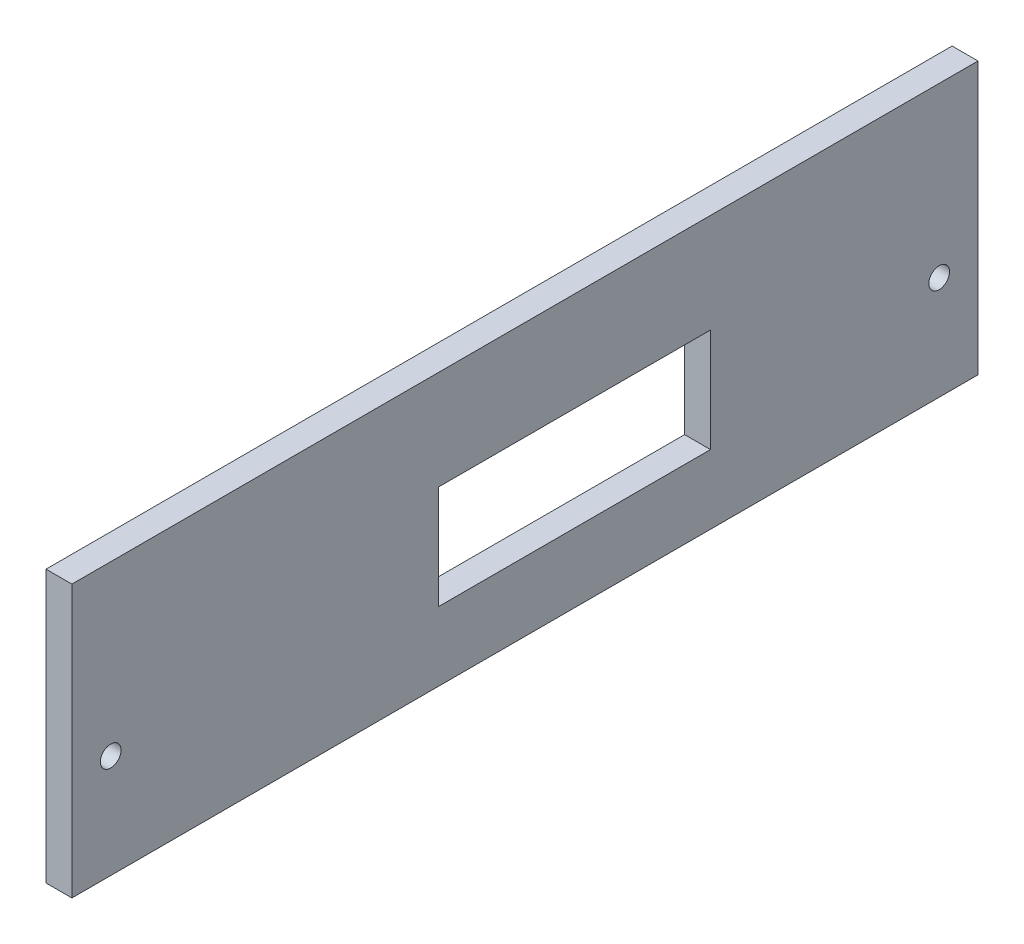
ISO-10303-21;
HEADER;
FILE_DESCRIPTION(('STEP AP214'),'2;1');
FILE_NAME('part.step','',(''),(''),'','','');
FILE_SCHEMA(('AUTOMOTIVE_DESIGN { 1 0 10303 214 1 1 1 1 }'));
ENDSEC;
DATA;
#1=APPLICATION_CONTEXT('core data for automotive mechanical design processes');
#2=APPLICATION_PROTOCOL_DEFINITION('international standard','automotive_design',2000,#1);
#3=PRODUCT_CONTEXT('',#1,'mechanical');
#4=PRODUCT('Part','Part','',(#3));
#5=PRODUCT_RELATED_PRODUCT_CATEGORY('part','',(#4));
#6=PRODUCT_DEFINITION_FORMATION('','',#4);
#7=PRODUCT_DEFINITION_CONTEXT('part definition',#1,'design');
#8=PRODUCT_DEFINITION('design','',#6,#7);
#9=PRODUCT_DEFINITION_SHAPE('','',#8);
#10=(LENGTH_UNIT() NAMED_UNIT(*) SI_UNIT(.MILLI.,.METRE.));
#11=(NAMED_UNIT(*) PLANE_ANGLE_UNIT() SI_UNIT($,.RADIAN.));
#12=(NAMED_UNIT(*) SI_UNIT($,.STERADIAN.) SOLID_ANGLE_UNIT());
#13=UNCERTAINTY_MEASURE_WITH_UNIT(LENGTH_MEASURE(1.E-05),#10,'distance_accuracy_value','');
#14=(GEOMETRIC_REPRESENTATION_CONTEXT(3) GLOBAL_UNCERTAINTY_ASSIGNED_CONTEXT((#13)) GLOBAL_UNIT_ASSIGNED_CONTEXT((#10,
#11,#12)) REPRESENTATION_CONTEXT('',''));
#15=CARTESIAN_POINT('',(0.,0.,0.));
#16=DIRECTION('',(0.,0.,1.));
#17=DIRECTION('',(1.,0.,0.));
#18=AXIS2_PLACEMENT_3D('',#15,#16,#17);
#19=CARTESIAN_POINT('',(-1.5,0.,0.));
#20=DIRECTION('',(1.,0.,0.));
#21=DIRECTION('',(0.,0.,-1.));
#22=AXIS2_PLACEMENT_3D('',#19,#20,#21);
#23=PLANE('',#22);
#24=CARTESIAN_POINT('',(-1.5,4.75,-49.5));
#25=DIRECTION('',(-1.,0.,0.));
#26=DIRECTION('',(0.,0.,1.));
#27=AXIS2_PLACEMENT_3D('',#24,#25,#26);
#28=CIRCLE('',#27,0.6);
#29=CARTESIAN_POINT('',(-1.5,4.75,-48.9));
#30=VERTEX_POINT('',#29);
#31=EDGE_CURVE('E127',#30,#30,#28,.T.);
#32=ORIENTED_EDGE('',*,*,#31,.F.);
#33=EDGE_LOOP('',(#32));
#34=FACE_BOUND('',#33,.T.);
#35=DIRECTION('',(0.,-1.,0.));
#36=VECTOR('',#35,1.);
#37=CARTESIAN_POINT('',(-1.5,14.5,-51.75));
#38=LINE('',#37,#36);
#39=CARTESIAN_POINT('',(-1.5,14.5,-51.75));
#40=VERTEX_POINT('',#39);
#41=CARTESIAN_POINT('',(-1.5,-1.25,-51.75));
#42=VERTEX_POINT('',#41);
#43=EDGE_CURVE('E137',#40,#42,#38,.T.);
#44=ORIENTED_EDGE('',*,*,#43,.T.);
#45=DIRECTION('',(0.,0.,1.));
#46=VECTOR('',#45,1.);
#47=CARTESIAN_POINT('',(-1.5,-1.25,0.75));
#48=LINE('',#47,#46);
#49=CARTESIAN_POINT('',(-1.5,-1.25,0.75));
#50=VERTEX_POINT('',#49);
#51=EDGE_CURVE('E140',#42,#50,#48,.T.);
#52=ORIENTED_EDGE('',*,*,#51,.T.);
#53=DIRECTION('',(0.,1.,0.));
#54=VECTOR('',#53,1.);
#55=CARTESIAN_POINT('',(-1.5,-1.25,0.75));
#56=LINE('',#55,#54);
#57=CARTESIAN_POINT('',(-1.5,14.5,0.75));
#58=VERTEX_POINT('',#57);
#59=EDGE_CURVE('E143',#50,#58,#56,.T.);
#60=ORIENTED_EDGE('',*,*,#59,.T.);
#61=DIRECTION('',(0.,0.,-1.));
#62=VECTOR('',#61,1.);
#63=CARTESIAN_POINT('',(-1.5,14.5,-51.75));
#64=LINE('',#63,#62);
#65=EDGE_CURVE('E145',#58,#40,#64,.T.);
#66=ORIENTED_EDGE('',*,*,#65,.T.);
#67=EDGE_LOOP('',(#44,#52,#60,#66));
#68=FACE_BOUND('',#67,.T.);
#69=DIRECTION('',(0.,0.,-1.));
#70=VECTOR('',#69,1.);
#71=CARTESIAN_POINT('',(-1.5,8.75,-36.25));
#72=LINE('',#71,#70);
#73=CARTESIAN_POINT('',(-1.5,8.75,-20.5));
#74=VERTEX_POINT('',#73);
#75=CARTESIAN_POINT('',(-1.5,8.75,-36.25));
#76=VERTEX_POINT('',#75);
#77=EDGE_CURVE('E98',#74,#76,#72,.T.);
#78=ORIENTED_EDGE('',*,*,#77,.F.);
#79=DIRECTION('',(0.,1.,0.));
#80=VECTOR('',#79,1.);
#81=CARTESIAN_POINT('',(-1.5,8.75,-20.5));
#82=LINE('',#81,#80);
#83=CARTESIAN_POINT('',(-1.5,2.75,-20.5));
#84=VERTEX_POINT('',#83);
#85=EDGE_CURVE('E121',#84,#74,#82,.T.);
#86=ORIENTED_EDGE('',*,*,#85,.F.);
#87=DIRECTION('',(0.,0.,1.));
#88=VECTOR('',#87,1.);
#89=CARTESIAN_POINT('',(-1.5,2.75,-20.5));
#90=LINE('',#89,#88);
#91=CARTESIAN_POINT('',(-1.5,2.75,-36.25));
#92=VERTEX_POINT('',#91);
#93=EDGE_CURVE('E119',#92,#84,#90,.T.);
#94=ORIENTED_EDGE('',*,*,#93,.F.);
#95=DIRECTION('',(0.,-1.,0.));
#96=VECTOR('',#95,1.);
#97=CARTESIAN_POINT('',(-1.5,8.75,-36.25));
#98=LINE('',#97,#96);
#99=EDGE_CURVE('E106',#76,#92,#98,.T.);
#100=ORIENTED_EDGE('',*,*,#99,.F.);
#101=EDGE_LOOP('',(#78,#86,#94,#100));
#102=FACE_BOUND('',#101,.T.);
#103=CARTESIAN_POINT('',(-1.5,4.75,-1.49999999999999));
#104=DIRECTION('',(-1.,0.,0.));
#105=DIRECTION('',(0.,0.,1.));
#106=AXIS2_PLACEMENT_3D('',#103,#104,#105);
#107=CIRCLE('',#106,0.6);
#108=CARTESIAN_POINT('',(-1.5,4.75,-0.899999999999994));
#109=VERTEX_POINT('',#108);
#110=EDGE_CURVE('E228',#109,#109,#107,.T.);
#111=ORIENTED_EDGE('',*,*,#110,.F.);
#112=EDGE_LOOP('',(#111));
#113=FACE_BOUND('',#112,.T.);
#114=ADVANCED_FACE('F33',(#34,#68,#102,#113),#23,.F.);
#115=CARTESIAN_POINT('',(0.,0.,0.));
#116=DIRECTION('',(1.,0.,0.));
#117=DIRECTION('',(0.,0.,-1.));
#118=AXIS2_PLACEMENT_3D('',#115,#116,#117);
#119=PLANE('',#118);
#120=CARTESIAN_POINT('',(0.,4.75,-49.5));
#121=DIRECTION('',(-1.,0.,0.));
#122=DIRECTION('',(0.,0.,1.));
#123=AXIS2_PLACEMENT_3D('',#120,#121,#122);
#124=CIRCLE('',#123,0.6);
#125=CARTESIAN_POINT('',(0.,4.75,-48.9));
#126=VERTEX_POINT('',#125);
#127=EDGE_CURVE('E234',#126,#126,#124,.T.);
#128=ORIENTED_EDGE('',*,*,#127,.T.);
#129=EDGE_LOOP('',(#128));
#130=FACE_BOUND('',#129,.T.);
#131=DIRECTION('',(0.,-1.,0.));
#132=VECTOR('',#131,1.);
#133=CARTESIAN_POINT('',(0.,14.5,-51.75));
#134=LINE('',#133,#132);
#135=CARTESIAN_POINT('',(0.,14.5,-51.75));
#136=VERTEX_POINT('',#135);
#137=CARTESIAN_POINT('',(0.,-1.25,-51.75));
#138=VERTEX_POINT('',#137);
#139=EDGE_CURVE('E114',#136,#138,#134,.T.);
#140=ORIENTED_EDGE('',*,*,#139,.F.);
#141=DIRECTION('',(0.,0.,-1.));
#142=VECTOR('',#141,1.);
#143=CARTESIAN_POINT('',(0.,14.5,-51.75));
#144=LINE('',#143,#142);
#145=CARTESIAN_POINT('',(0.,14.5,0.75));
#146=VERTEX_POINT('',#145);
#147=EDGE_CURVE('E141',#146,#136,#144,.T.);
#148=ORIENTED_EDGE('',*,*,#147,.F.);
#149=DIRECTION('',(0.,1.,0.));
#150=VECTOR('',#149,1.);
#151=CARTESIAN_POINT('',(0.,-1.25,0.75));
#152=LINE('',#151,#150);
#153=CARTESIAN_POINT('',(0.,-1.25,0.75));
#154=VERTEX_POINT('',#153);
#155=EDGE_CURVE('E152',#154,#146,#152,.T.);
#156=ORIENTED_EDGE('',*,*,#155,.F.);
#157=DIRECTION('',(0.,0.,1.));
#158=VECTOR('',#157,1.);
#159=CARTESIAN_POINT('',(0.,-1.25,0.75));
#160=LINE('',#159,#158);
#161=EDGE_CURVE('E150',#138,#154,#160,.T.);
#162=ORIENTED_EDGE('',*,*,#161,.F.);
#163=EDGE_LOOP('',(#140,#148,#156,#162));
#164=FACE_BOUND('',#163,.T.);
#165=DIRECTION('',(0.,1.,0.));
#166=VECTOR('',#165,1.);
#167=CARTESIAN_POINT('',(0.,8.75,-20.5));
#168=LINE('',#167,#166);
#169=CARTESIAN_POINT('',(0.,2.75,-20.5));
#170=VERTEX_POINT('',#169);
#171=CARTESIAN_POINT('',(0.,8.75,-20.5));
#172=VERTEX_POINT('',#171);
#173=EDGE_CURVE('E107',#170,#172,#168,.T.);
#174=ORIENTED_EDGE('',*,*,#173,.T.);
#175=DIRECTION('',(0.,0.,-1.));
#176=VECTOR('',#175,1.);
#177=CARTESIAN_POINT('',(0.,8.75,-36.25));
#178=LINE('',#177,#176);
#179=CARTESIAN_POINT('',(0.,8.75,-36.25));
#180=VERTEX_POINT('',#179);
#181=EDGE_CURVE('E56',#172,#180,#178,.T.);
#182=ORIENTED_EDGE('',*,*,#181,.T.);
#183=DIRECTION('',(0.,-1.,0.));
#184=VECTOR('',#183,1.);
#185=CARTESIAN_POINT('',(0.,8.75,-36.25));
#186=LINE('',#185,#184);
#187=CARTESIAN_POINT('',(0.,2.75,-36.25));
#188=VERTEX_POINT('',#187);
#189=EDGE_CURVE('E113',#180,#188,#186,.T.);
#190=ORIENTED_EDGE('',*,*,#189,.T.);
#191=DIRECTION('',(0.,0.,1.));
#192=VECTOR('',#191,1.);
#193=CARTESIAN_POINT('',(0.,2.75,-20.5));
#194=LINE('',#193,#192);
#195=EDGE_CURVE('E129',#188,#170,#194,.T.);
#196=ORIENTED_EDGE('',*,*,#195,.T.);
#197=EDGE_LOOP('',(#174,#182,#190,#196));
#198=FACE_BOUND('',#197,.T.);
#199=CARTESIAN_POINT('',(0.,4.75,-1.49999999999999));
#200=DIRECTION('',(-1.,0.,0.));
#201=DIRECTION('',(0.,0.,1.));
#202=AXIS2_PLACEMENT_3D('',#199,#200,#201);
#203=CIRCLE('',#202,0.6);
#204=CARTESIAN_POINT('',(0.,4.75,-0.899999999999994));
#205=VERTEX_POINT('',#204);
#206=EDGE_CURVE('E231',#205,#205,#203,.T.);
#207=ORIENTED_EDGE('',*,*,#206,.T.);
#208=EDGE_LOOP('',(#207));
#209=FACE_BOUND('',#208,.T.);
#210=ADVANCED_FACE('F170',(#130,#164,#198,#209),#119,.T.);
#211=CARTESIAN_POINT('',(-1.5,14.5,-51.75));
#212=DIRECTION('',(0.,0.,1.));
#213=DIRECTION('',(1.,0.,0.));
#214=AXIS2_PLACEMENT_3D('',#211,#212,#213);
#215=PLANE('',#214);
#216=ORIENTED_EDGE('',*,*,#139,.T.);
#217=DIRECTION('',(1.,0.,0.));
#218=VECTOR('',#217,1.);
#219=CARTESIAN_POINT('',(-1.5,-1.25,-51.75));
#220=LINE('',#219,#218);
#221=EDGE_CURVE('E11',#42,#138,#220,.T.);
#222=ORIENTED_EDGE('',*,*,#221,.F.);
#223=ORIENTED_EDGE('',*,*,#43,.F.);
#224=DIRECTION('',(1.,0.,0.));
#225=VECTOR('',#224,1.);
#226=CARTESIAN_POINT('',(-1.5,14.5,-51.75));
#227=LINE('',#226,#225);
#228=EDGE_CURVE('E147',#40,#136,#227,.T.);
#229=ORIENTED_EDGE('',*,*,#228,.T.);
#230=EDGE_LOOP('',(#216,#222,#223,#229));
#231=FACE_BOUND('',#230,.T.);
#232=ADVANCED_FACE('F35',(#231),#215,.F.);
#233=CARTESIAN_POINT('',(-1.5,-1.25,0.75));
#234=DIRECTION('',(0.,1.,0.));
#235=DIRECTION('',(0.,0.,1.));
#236=AXIS2_PLACEMENT_3D('',#233,#234,#235);
#237=PLANE('',#236);
#238=ORIENTED_EDGE('',*,*,#161,.T.);
#239=DIRECTION('',(1.,0.,0.));
#240=VECTOR('',#239,1.);
#241=CARTESIAN_POINT('',(-1.5,-1.25,0.75));
#242=LINE('',#241,#240);
#243=EDGE_CURVE('E41',#50,#154,#242,.T.);
#244=ORIENTED_EDGE('',*,*,#243,.F.);
#245=ORIENTED_EDGE('',*,*,#51,.F.);
#246=ORIENTED_EDGE('',*,*,#221,.T.);
#247=EDGE_LOOP('',(#238,#244,#245,#246));
#248=FACE_BOUND('',#247,.T.);
#249=ADVANCED_FACE('F180',(#248),#237,.F.);
#250=CARTESIAN_POINT('',(-1.5,-1.25,0.75));
#251=DIRECTION('',(0.,0.,-1.));
#252=DIRECTION('',(-1.,0.,0.));
#253=AXIS2_PLACEMENT_3D('',#250,#251,#252);
#254=PLANE('',#253);
#255=ORIENTED_EDGE('',*,*,#155,.T.);
#256=DIRECTION('',(1.,0.,0.));
#257=VECTOR('',#256,1.);
#258=CARTESIAN_POINT('',(-1.5,14.5,0.75));
#259=LINE('',#258,#257);
#260=EDGE_CURVE('E157',#58,#146,#259,.T.);
#261=ORIENTED_EDGE('',*,*,#260,.F.);
#262=ORIENTED_EDGE('',*,*,#59,.F.);
#263=ORIENTED_EDGE('',*,*,#243,.T.);
#264=EDGE_LOOP('',(#255,#261,#262,#263));
#265=FACE_BOUND('',#264,.T.);
#266=ADVANCED_FACE('F164',(#265),#254,.F.);
#267=CARTESIAN_POINT('',(-1.5,14.5,-51.75));
#268=DIRECTION('',(0.,-1.,0.));
#269=DIRECTION('',(0.,0.,-1.));
#270=AXIS2_PLACEMENT_3D('',#267,#268,#269);
#271=PLANE('',#270);
#272=ORIENTED_EDGE('',*,*,#147,.T.);
#273=ORIENTED_EDGE('',*,*,#228,.F.);
#274=ORIENTED_EDGE('',*,*,#65,.F.);
#275=ORIENTED_EDGE('',*,*,#260,.T.);
#276=EDGE_LOOP('',(#272,#273,#274,#275));
#277=FACE_BOUND('',#276,.T.);
#278=ADVANCED_FACE('F174',(#277),#271,.F.);
#279=CARTESIAN_POINT('',(-1.5,8.75,-36.25));
#280=DIRECTION('',(0.,-1.,0.));
#281=DIRECTION('',(0.,0.,-1.));
#282=AXIS2_PLACEMENT_3D('',#279,#280,#281);
#283=PLANE('',#282);
#284=ORIENTED_EDGE('',*,*,#181,.F.);
#285=DIRECTION('',(1.,0.,0.));
#286=VECTOR('',#285,1.);
#287=CARTESIAN_POINT('',(-1.5,8.75,-20.5));
#288=LINE('',#287,#286);
#289=EDGE_CURVE('E102',#74,#172,#288,.T.);
#290=ORIENTED_EDGE('',*,*,#289,.F.);
#291=ORIENTED_EDGE('',*,*,#77,.T.);
#292=DIRECTION('',(1.,0.,0.));
#293=VECTOR('',#292,1.);
#294=CARTESIAN_POINT('',(-1.5,8.75,-36.25));
#295=LINE('',#294,#293);
#296=EDGE_CURVE('E101',#76,#180,#295,.T.);
#297=ORIENTED_EDGE('',*,*,#296,.T.);
#298=EDGE_LOOP('',(#284,#290,#291,#297));
#299=FACE_BOUND('',#298,.T.);
#300=ADVANCED_FACE('F100',(#299),#283,.T.);
#301=CARTESIAN_POINT('',(-1.5,8.75,-36.25));
#302=DIRECTION('',(0.,0.,1.));
#303=DIRECTION('',(1.,0.,0.));
#304=AXIS2_PLACEMENT_3D('',#301,#302,#303);
#305=PLANE('',#304);
#306=ORIENTED_EDGE('',*,*,#189,.F.);
#307=ORIENTED_EDGE('',*,*,#296,.F.);
#308=ORIENTED_EDGE('',*,*,#99,.T.);
#309=DIRECTION('',(1.,0.,0.));
#310=VECTOR('',#309,1.);
#311=CARTESIAN_POINT('',(-1.5,2.75,-36.25));
#312=LINE('',#311,#310);
#313=EDGE_CURVE('E115',#92,#188,#312,.T.);
#314=ORIENTED_EDGE('',*,*,#313,.T.);
#315=EDGE_LOOP('',(#306,#307,#308,#314));
#316=FACE_BOUND('',#315,.T.);
#317=ADVANCED_FACE('F110',(#316),#305,.T.);
#318=CARTESIAN_POINT('',(-1.5,2.75,-20.5));
#319=DIRECTION('',(0.,1.,0.));
#320=DIRECTION('',(0.,0.,1.));
#321=AXIS2_PLACEMENT_3D('',#318,#319,#320);
#322=PLANE('',#321);
#323=ORIENTED_EDGE('',*,*,#195,.F.);
#324=ORIENTED_EDGE('',*,*,#313,.F.);
#325=ORIENTED_EDGE('',*,*,#93,.T.);
#326=DIRECTION('',(1.,0.,0.));
#327=VECTOR('',#326,1.);
#328=CARTESIAN_POINT('',(-1.5,2.75,-20.5));
#329=LINE('',#328,#327);
#330=EDGE_CURVE('E48',#84,#170,#329,.T.);
#331=ORIENTED_EDGE('',*,*,#330,.T.);
#332=EDGE_LOOP('',(#323,#324,#325,#331));
#333=FACE_BOUND('',#332,.T.);
#334=ADVANCED_FACE('F206',(#333),#322,.T.);
#335=CARTESIAN_POINT('',(-1.5,8.75,-20.5));
#336=DIRECTION('',(0.,0.,-1.));
#337=DIRECTION('',(-1.,0.,0.));
#338=AXIS2_PLACEMENT_3D('',#335,#336,#337);
#339=PLANE('',#338);
#340=ORIENTED_EDGE('',*,*,#173,.F.);
#341=ORIENTED_EDGE('',*,*,#330,.F.);
#342=ORIENTED_EDGE('',*,*,#85,.T.);
#343=ORIENTED_EDGE('',*,*,#289,.T.);
#344=EDGE_LOOP('',(#340,#341,#342,#343));
#345=FACE_BOUND('',#344,.T.);
#346=ADVANCED_FACE('F210',(#345),#339,.T.);
#347=CARTESIAN_POINT('',(-1.5,4.75,-49.5));
#348=DIRECTION('',(1.,0.,0.));
#349=DIRECTION('',(0.,0.,-1.));
#350=AXIS2_PLACEMENT_3D('',#347,#348,#349);
#351=CYLINDRICAL_SURFACE('',#350,0.6);
#352=ORIENTED_EDGE('',*,*,#31,.T.);
#353=EDGE_LOOP('',(#352));
#354=FACE_BOUND('',#353,.T.);
#355=ORIENTED_EDGE('',*,*,#127,.F.);
#356=EDGE_LOOP('',(#355));
#357=FACE_BOUND('',#356,.T.);
#358=ADVANCED_FACE('F216',(#354,#357),#351,.F.);
#359=CARTESIAN_POINT('',(-1.5,4.75,-1.49999999999999));
#360=DIRECTION('',(1.,0.,0.));
#361=DIRECTION('',(0.,0.,-1.));
#362=AXIS2_PLACEMENT_3D('',#359,#360,#361);
#363=CYLINDRICAL_SURFACE('',#362,0.6);
#364=ORIENTED_EDGE('',*,*,#110,.T.);
#365=EDGE_LOOP('',(#364));
#366=FACE_BOUND('',#365,.T.);
#367=ORIENTED_EDGE('',*,*,#206,.F.);
#368=EDGE_LOOP('',(#367));
#369=FACE_BOUND('',#368,.T.);
#370=ADVANCED_FACE('F219',(#366,#369),#363,.F.);
#371=CLOSED_SHELL('',(#114,#210,#232,#249,#266,#278,#300,#317,#334,#346,#358,#370));
#372=MANIFOLD_SOLID_BREP('B2',#371);
#373=ADVANCED_BREP_SHAPE_REPRESENTATION('',(#18,#372),#14);
#374=SHAPE_DEFINITION_REPRESENTATION(#9,#373);
ENDSEC;
END-ISO-10303-21;
